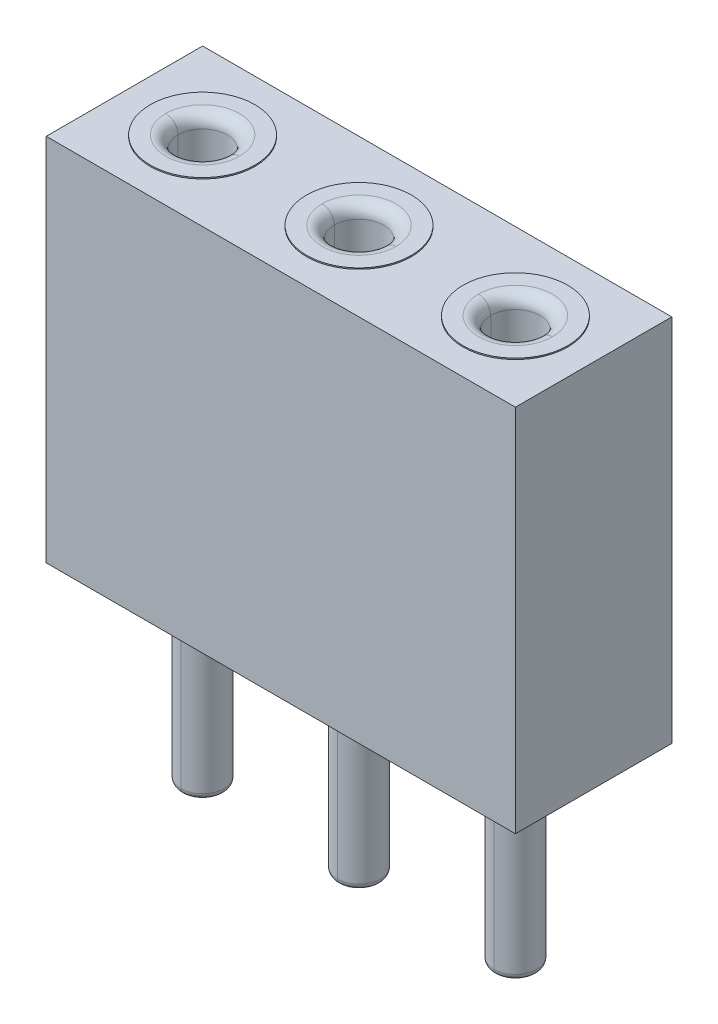
ISO-10303-21;
HEADER;
FILE_DESCRIPTION(('STEP AP214'),'2;1');
FILE_NAME('part.step','',(''),(''),'','','');
FILE_SCHEMA(('AUTOMOTIVE_DESIGN { 1 0 10303 214 1 1 1 1 }'));
ENDSEC;
DATA;
#1=APPLICATION_CONTEXT('core data for automotive mechanical design processes');
#2=APPLICATION_PROTOCOL_DEFINITION('international standard','automotive_design',2000,#1);
#3=PRODUCT_CONTEXT('',#1,'mechanical');
#4=PRODUCT('Part','Part','',(#3));
#5=PRODUCT_RELATED_PRODUCT_CATEGORY('part','',(#4));
#6=PRODUCT_DEFINITION_FORMATION('','',#4);
#7=PRODUCT_DEFINITION_CONTEXT('part definition',#1,'design');
#8=PRODUCT_DEFINITION('design','',#6,#7);
#9=PRODUCT_DEFINITION_SHAPE('','',#8);
#10=(LENGTH_UNIT() NAMED_UNIT(*) SI_UNIT(.MILLI.,.METRE.));
#11=(NAMED_UNIT(*) PLANE_ANGLE_UNIT() SI_UNIT($,.RADIAN.));
#12=(NAMED_UNIT(*) SI_UNIT($,.STERADIAN.) SOLID_ANGLE_UNIT());
#13=UNCERTAINTY_MEASURE_WITH_UNIT(LENGTH_MEASURE(1.E-05),#10,'distance_accuracy_value','');
#14=(GEOMETRIC_REPRESENTATION_CONTEXT(3) GLOBAL_UNCERTAINTY_ASSIGNED_CONTEXT((#13)) GLOBAL_UNIT_ASSIGNED_CONTEXT((#10,
#11,#12)) REPRESENTATION_CONTEXT('',''));
#15=CARTESIAN_POINT('',(0.,0.,0.));
#16=DIRECTION('',(0.,0.,1.));
#17=DIRECTION('',(1.,0.,0.));
#18=AXIS2_PLACEMENT_3D('',#15,#16,#17);
#19=CARTESIAN_POINT('',(6.35,5.82,1.27));
#20=DIRECTION('',(0.,1.,0.));
#21=DIRECTION('',(-1.,0.,0.));
#22=AXIS2_PLACEMENT_3D('',#19,#20,#21);
#23=TOROIDAL_SURFACE('',#22,0.6,0.2);
#24=CARTESIAN_POINT('',(6.95,5.82,1.27));
#25=DIRECTION('',(0.,0.,1.));
#26=DIRECTION('',(1.,0.,0.));
#27=AXIS2_PLACEMENT_3D('',#24,#25,#26);
#28=CIRCLE('',#27,0.2);
#29=CARTESIAN_POINT('',(6.95,6.02,1.27));
#30=VERTEX_POINT('',#29);
#31=CARTESIAN_POINT('',(6.75,5.82,1.27));
#32=VERTEX_POINT('',#31);
#33=EDGE_CURVE('E403',#30,#32,#28,.T.);
#34=ORIENTED_EDGE('',*,*,#33,.F.);
#35=CARTESIAN_POINT('',(6.35,6.02,1.27));
#36=DIRECTION('',(0.,-1.,0.));
#37=DIRECTION('',(-1.,0.,0.));
#38=AXIS2_PLACEMENT_3D('',#35,#36,#37);
#39=CIRCLE('',#38,0.6);
#40=CARTESIAN_POINT('',(5.75,6.02,1.27));
#41=VERTEX_POINT('',#40);
#42=EDGE_CURVE('E361',#41,#30,#39,.T.);
#43=ORIENTED_EDGE('',*,*,#42,.F.);
#44=CARTESIAN_POINT('',(5.75,5.82,1.27));
#45=DIRECTION('',(0.,0.,-1.));
#46=DIRECTION('',(-1.,0.,0.));
#47=AXIS2_PLACEMENT_3D('',#44,#45,#46);
#48=CIRCLE('',#47,0.2);
#49=CARTESIAN_POINT('',(5.95,5.82,1.27));
#50=VERTEX_POINT('',#49);
#51=EDGE_CURVE('E384',#41,#50,#48,.T.);
#52=ORIENTED_EDGE('',*,*,#51,.T.);
#53=CARTESIAN_POINT('',(6.35,5.82,1.27));
#54=DIRECTION('',(0.,1.,0.));
#55=DIRECTION('',(-1.,0.,0.));
#56=AXIS2_PLACEMENT_3D('',#53,#54,#55);
#57=CIRCLE('',#56,0.4);
#58=EDGE_CURVE('E393',#32,#50,#57,.T.);
#59=ORIENTED_EDGE('',*,*,#58,.F.);
#60=EDGE_LOOP('',(#34,#43,#52,#59));
#61=FACE_BOUND('',#60,.T.);
#62=ADVANCED_FACE('F16',(#61),#23,.T.);
#63=CARTESIAN_POINT('',(3.81,5.82,1.27));
#64=DIRECTION('',(0.,1.,0.));
#65=DIRECTION('',(-1.,0.,0.));
#66=AXIS2_PLACEMENT_3D('',#63,#64,#65);
#67=TOROIDAL_SURFACE('',#66,0.6,0.2);
#68=CARTESIAN_POINT('',(4.41,5.82,1.27));
#69=DIRECTION('',(0.,0.,1.));
#70=DIRECTION('',(1.,0.,0.));
#71=AXIS2_PLACEMENT_3D('',#68,#69,#70);
#72=CIRCLE('',#71,0.2);
#73=CARTESIAN_POINT('',(4.41,6.02,1.27));
#74=VERTEX_POINT('',#73);
#75=CARTESIAN_POINT('',(4.21,5.82,1.27));
#76=VERTEX_POINT('',#75);
#77=EDGE_CURVE('E246',#74,#76,#72,.T.);
#78=ORIENTED_EDGE('',*,*,#77,.F.);
#79=CARTESIAN_POINT('',(3.81,6.02,1.27));
#80=DIRECTION('',(0.,-1.,0.));
#81=DIRECTION('',(-1.,0.,0.));
#82=AXIS2_PLACEMENT_3D('',#79,#80,#81);
#83=CIRCLE('',#82,0.6);
#84=CARTESIAN_POINT('',(3.21,6.02,1.27));
#85=VERTEX_POINT('',#84);
#86=EDGE_CURVE('E353',#85,#74,#83,.T.);
#87=ORIENTED_EDGE('',*,*,#86,.F.);
#88=CARTESIAN_POINT('',(3.21,5.82,1.27));
#89=DIRECTION('',(0.,0.,-1.));
#90=DIRECTION('',(-1.,0.,0.));
#91=AXIS2_PLACEMENT_3D('',#88,#89,#90);
#92=CIRCLE('',#91,0.2);
#93=CARTESIAN_POINT('',(3.41,5.82,1.27));
#94=VERTEX_POINT('',#93);
#95=EDGE_CURVE('E555',#85,#94,#92,.T.);
#96=ORIENTED_EDGE('',*,*,#95,.T.);
#97=CARTESIAN_POINT('',(3.81,5.82,1.27));
#98=DIRECTION('',(0.,1.,0.));
#99=DIRECTION('',(-1.,0.,0.));
#100=AXIS2_PLACEMENT_3D('',#97,#98,#99);
#101=CIRCLE('',#100,0.4);
#102=EDGE_CURVE('E343',#76,#94,#101,.T.);
#103=ORIENTED_EDGE('',*,*,#102,.F.);
#104=EDGE_LOOP('',(#78,#87,#96,#103));
#105=FACE_BOUND('',#104,.T.);
#106=ADVANCED_FACE('F943',(#105),#67,.T.);
#107=CARTESIAN_POINT('',(1.27,5.82,1.27));
#108=DIRECTION('',(0.,1.,0.));
#109=DIRECTION('',(-1.,0.,0.));
#110=AXIS2_PLACEMENT_3D('',#107,#108,#109);
#111=TOROIDAL_SURFACE('',#110,0.6,0.2);
#112=CARTESIAN_POINT('',(1.87,5.82,1.27));
#113=DIRECTION('',(0.,0.,1.));
#114=DIRECTION('',(1.,0.,0.));
#115=AXIS2_PLACEMENT_3D('',#112,#113,#114);
#116=CIRCLE('',#115,0.2);
#117=CARTESIAN_POINT('',(1.87,6.02,1.27));
#118=VERTEX_POINT('',#117);
#119=CARTESIAN_POINT('',(1.67,5.82,1.27));
#120=VERTEX_POINT('',#119);
#121=EDGE_CURVE('E543',#118,#120,#116,.T.);
#122=ORIENTED_EDGE('',*,*,#121,.F.);
#123=CARTESIAN_POINT('',(1.27,6.02,1.27));
#124=DIRECTION('',(0.,-1.,0.));
#125=DIRECTION('',(-1.,0.,0.));
#126=AXIS2_PLACEMENT_3D('',#123,#124,#125);
#127=CIRCLE('',#126,0.6);
#128=CARTESIAN_POINT('',(0.67,6.02,1.27));
#129=VERTEX_POINT('',#128);
#130=EDGE_CURVE('E295',#129,#118,#127,.T.);
#131=ORIENTED_EDGE('',*,*,#130,.F.);
#132=CARTESIAN_POINT('',(0.67,5.82,1.27));
#133=DIRECTION('',(0.,0.,-1.));
#134=DIRECTION('',(-1.,0.,0.));
#135=AXIS2_PLACEMENT_3D('',#132,#133,#134);
#136=CIRCLE('',#135,0.2);
#137=CARTESIAN_POINT('',(0.87,5.82,1.27));
#138=VERTEX_POINT('',#137);
#139=EDGE_CURVE('E292',#129,#138,#136,.T.);
#140=ORIENTED_EDGE('',*,*,#139,.T.);
#141=CARTESIAN_POINT('',(1.27,5.82,1.27));
#142=DIRECTION('',(0.,1.,0.));
#143=DIRECTION('',(-1.,0.,0.));
#144=AXIS2_PLACEMENT_3D('',#141,#142,#143);
#145=CIRCLE('',#144,0.4);
#146=EDGE_CURVE('E149',#120,#138,#145,.T.);
#147=ORIENTED_EDGE('',*,*,#146,.F.);
#148=EDGE_LOOP('',(#122,#131,#140,#147));
#149=FACE_BOUND('',#148,.T.);
#150=ADVANCED_FACE('F572',(#149),#111,.T.);
#151=CARTESIAN_POINT('',(1.27,3.02,1.27));
#152=DIRECTION('',(0.,1.,0.));
#153=DIRECTION('',(1.,0.,0.));
#154=AXIS2_PLACEMENT_3D('',#151,#152,#153);
#155=PLANE('',#154);
#156=CARTESIAN_POINT('',(1.27,3.02,1.27));
#157=DIRECTION('',(0.,1.,0.));
#158=DIRECTION('',(-1.,0.,0.));
#159=AXIS2_PLACEMENT_3D('',#156,#157,#158);
#160=CIRCLE('',#159,0.4);
#161=CARTESIAN_POINT('',(0.87,3.02,1.27));
#162=VERTEX_POINT('',#161);
#163=CARTESIAN_POINT('',(1.67,3.02,1.27));
#164=VERTEX_POINT('',#163);
#165=EDGE_CURVE('E11',#162,#164,#160,.T.);
#166=ORIENTED_EDGE('',*,*,#165,.T.);
#167=CARTESIAN_POINT('',(1.27,3.02,1.27));
#168=DIRECTION('',(0.,1.,0.));
#169=DIRECTION('',(-1.,0.,0.));
#170=AXIS2_PLACEMENT_3D('',#167,#168,#169);
#171=CIRCLE('',#170,0.4);
#172=EDGE_CURVE('E277',#164,#162,#171,.T.);
#173=ORIENTED_EDGE('',*,*,#172,.T.);
#174=EDGE_LOOP('',(#166,#173));
#175=FACE_BOUND('',#174,.T.);
#176=ADVANCED_FACE('F580',(#175),#155,.T.);
#177=CARTESIAN_POINT('',(1.27,3.02,1.27));
#178=DIRECTION('',(0.,1.,0.));
#179=DIRECTION('',(-1.,0.,0.));
#180=AXIS2_PLACEMENT_3D('',#177,#178,#179);
#181=CYLINDRICAL_SURFACE('',#180,0.4);
#182=DIRECTION('',(0.,1.,0.));
#183=VECTOR('',#182,1.);
#184=CARTESIAN_POINT('',(1.67,3.02,1.27));
#185=LINE('',#184,#183);
#186=EDGE_CURVE('E274',#164,#120,#185,.T.);
#187=ORIENTED_EDGE('',*,*,#186,.F.);
#188=ORIENTED_EDGE('',*,*,#165,.F.);
#189=DIRECTION('',(0.,1.,0.));
#190=VECTOR('',#189,1.);
#191=CARTESIAN_POINT('',(0.87,3.02,1.27));
#192=LINE('',#191,#190);
#193=EDGE_CURVE('E137',#162,#138,#192,.T.);
#194=ORIENTED_EDGE('',*,*,#193,.T.);
#195=CARTESIAN_POINT('',(1.27,5.82,1.27));
#196=DIRECTION('',(0.,1.,0.));
#197=DIRECTION('',(-1.,0.,0.));
#198=AXIS2_PLACEMENT_3D('',#195,#196,#197);
#199=CIRCLE('',#198,0.4);
#200=EDGE_CURVE('E540',#138,#120,#199,.T.);
#201=ORIENTED_EDGE('',*,*,#200,.T.);
#202=EDGE_LOOP('',(#187,#188,#194,#201));
#203=FACE_BOUND('',#202,.T.);
#204=ADVANCED_FACE('F578',(#203),#181,.F.);
#205=CARTESIAN_POINT('',(6.35,3.02,1.27));
#206=DIRECTION('',(0.,1.,0.));
#207=DIRECTION('',(1.,0.,0.));
#208=AXIS2_PLACEMENT_3D('',#205,#206,#207);
#209=PLANE('',#208);
#210=CARTESIAN_POINT('',(6.35,3.02,1.27));
#211=DIRECTION('',(0.,1.,0.));
#212=DIRECTION('',(-1.,0.,0.));
#213=AXIS2_PLACEMENT_3D('',#210,#211,#212);
#214=CIRCLE('',#213,0.4);
#215=CARTESIAN_POINT('',(5.95,3.02,1.27));
#216=VERTEX_POINT('',#215);
#217=CARTESIAN_POINT('',(6.75,3.02,1.27));
#218=VERTEX_POINT('',#217);
#219=EDGE_CURVE('E27',#216,#218,#214,.T.);
#220=ORIENTED_EDGE('',*,*,#219,.T.);
#221=CARTESIAN_POINT('',(6.35,3.02,1.27));
#222=DIRECTION('',(0.,1.,0.));
#223=DIRECTION('',(-1.,0.,0.));
#224=AXIS2_PLACEMENT_3D('',#221,#222,#223);
#225=CIRCLE('',#224,0.4);
#226=EDGE_CURVE('E269',#218,#216,#225,.T.);
#227=ORIENTED_EDGE('',*,*,#226,.T.);
#228=EDGE_LOOP('',(#220,#227));
#229=FACE_BOUND('',#228,.T.);
#230=ADVANCED_FACE('F911',(#229),#209,.T.);
#231=CARTESIAN_POINT('',(6.35,3.02,1.27));
#232=DIRECTION('',(0.,1.,0.));
#233=DIRECTION('',(-1.,0.,0.));
#234=AXIS2_PLACEMENT_3D('',#231,#232,#233);
#235=CYLINDRICAL_SURFACE('',#234,0.4);
#236=DIRECTION('',(0.,1.,0.));
#237=VECTOR('',#236,1.);
#238=CARTESIAN_POINT('',(6.75,3.02,1.27));
#239=LINE('',#238,#237);
#240=EDGE_CURVE('E273',#218,#32,#239,.T.);
#241=ORIENTED_EDGE('',*,*,#240,.F.);
#242=ORIENTED_EDGE('',*,*,#219,.F.);
#243=DIRECTION('',(0.,1.,0.));
#244=VECTOR('',#243,1.);
#245=CARTESIAN_POINT('',(5.95,3.02,1.27));
#246=LINE('',#245,#244);
#247=EDGE_CURVE('E262',#216,#50,#246,.T.);
#248=ORIENTED_EDGE('',*,*,#247,.T.);
#249=CARTESIAN_POINT('',(6.35,5.82,1.27));
#250=DIRECTION('',(0.,1.,0.));
#251=DIRECTION('',(-1.,0.,0.));
#252=AXIS2_PLACEMENT_3D('',#249,#250,#251);
#253=CIRCLE('',#252,0.4);
#254=EDGE_CURVE('E389',#50,#32,#253,.T.);
#255=ORIENTED_EDGE('',*,*,#254,.T.);
#256=EDGE_LOOP('',(#241,#242,#248,#255));
#257=FACE_BOUND('',#256,.T.);
#258=ADVANCED_FACE('F916',(#257),#235,.F.);
#259=CARTESIAN_POINT('',(3.81,3.02,1.27));
#260=DIRECTION('',(0.,1.,0.));
#261=DIRECTION('',(1.,0.,0.));
#262=AXIS2_PLACEMENT_3D('',#259,#260,#261);
#263=PLANE('',#262);
#264=CARTESIAN_POINT('',(3.81,3.02,1.27));
#265=DIRECTION('',(0.,1.,0.));
#266=DIRECTION('',(-1.,0.,0.));
#267=AXIS2_PLACEMENT_3D('',#264,#265,#266);
#268=CIRCLE('',#267,0.4);
#269=CARTESIAN_POINT('',(3.41,3.02,1.27));
#270=VERTEX_POINT('',#269);
#271=CARTESIAN_POINT('',(4.21,3.02,1.27));
#272=VERTEX_POINT('',#271);
#273=EDGE_CURVE('E203',#270,#272,#268,.T.);
#274=ORIENTED_EDGE('',*,*,#273,.T.);
#275=CARTESIAN_POINT('',(3.81,3.02,1.27));
#276=DIRECTION('',(0.,1.,0.));
#277=DIRECTION('',(-1.,0.,0.));
#278=AXIS2_PLACEMENT_3D('',#275,#276,#277);
#279=CIRCLE('',#278,0.4);
#280=EDGE_CURVE('E257',#272,#270,#279,.T.);
#281=ORIENTED_EDGE('',*,*,#280,.T.);
#282=EDGE_LOOP('',(#274,#281));
#283=FACE_BOUND('',#282,.T.);
#284=ADVANCED_FACE('F903',(#283),#263,.T.);
#285=CARTESIAN_POINT('',(3.81,3.02,1.27));
#286=DIRECTION('',(0.,1.,0.));
#287=DIRECTION('',(-1.,0.,0.));
#288=AXIS2_PLACEMENT_3D('',#285,#286,#287);
#289=CYLINDRICAL_SURFACE('',#288,0.4);
#290=DIRECTION('',(0.,1.,0.));
#291=VECTOR('',#290,1.);
#292=CARTESIAN_POINT('',(4.21,3.02,1.27));
#293=LINE('',#292,#291);
#294=EDGE_CURVE('E261',#272,#76,#293,.T.);
#295=ORIENTED_EDGE('',*,*,#294,.F.);
#296=ORIENTED_EDGE('',*,*,#273,.F.);
#297=DIRECTION('',(0.,1.,0.));
#298=VECTOR('',#297,1.);
#299=CARTESIAN_POINT('',(3.41,3.02,1.27));
#300=LINE('',#299,#298);
#301=EDGE_CURVE('E347',#270,#94,#300,.T.);
#302=ORIENTED_EDGE('',*,*,#301,.T.);
#303=CARTESIAN_POINT('',(3.81,5.82,1.27));
#304=DIRECTION('',(0.,1.,0.));
#305=DIRECTION('',(-1.,0.,0.));
#306=AXIS2_PLACEMENT_3D('',#303,#304,#305);
#307=CIRCLE('',#306,0.4);
#308=EDGE_CURVE('E560',#94,#76,#307,.T.);
#309=ORIENTED_EDGE('',*,*,#308,.T.);
#310=EDGE_LOOP('',(#295,#296,#302,#309));
#311=FACE_BOUND('',#310,.T.);
#312=ADVANCED_FACE('F898',(#311),#289,.F.);
#313=CARTESIAN_POINT('',(1.27,6.02,1.27));
#314=DIRECTION('',(0.,1.,0.));
#315=DIRECTION('',(1.,0.,0.));
#316=AXIS2_PLACEMENT_3D('',#313,#314,#315);
#317=PLANE('',#316);
#318=CARTESIAN_POINT('',(1.27,6.02,1.27));
#319=DIRECTION('',(0.,1.,0.));
#320=DIRECTION('',(-1.,0.,0.));
#321=AXIS2_PLACEMENT_3D('',#318,#319,#320);
#322=CIRCLE('',#321,0.85);
#323=CARTESIAN_POINT('',(2.12,6.02,1.27));
#324=VERTEX_POINT('',#323);
#325=CARTESIAN_POINT('',(0.42,6.02,1.27));
#326=VERTEX_POINT('',#325);
#327=EDGE_CURVE('E188',#324,#326,#322,.T.);
#328=ORIENTED_EDGE('',*,*,#327,.T.);
#329=CARTESIAN_POINT('',(1.27,6.02,1.27));
#330=DIRECTION('',(0.,1.,0.));
#331=DIRECTION('',(-1.,0.,0.));
#332=AXIS2_PLACEMENT_3D('',#329,#330,#331);
#333=CIRCLE('',#332,0.85);
#334=EDGE_CURVE('E407',#326,#324,#333,.T.);
#335=ORIENTED_EDGE('',*,*,#334,.T.);
#336=EDGE_LOOP('',(#328,#335));
#337=FACE_BOUND('',#336,.T.);
#338=ORIENTED_EDGE('',*,*,#130,.T.);
#339=CARTESIAN_POINT('',(1.27,6.02,1.27));
#340=DIRECTION('',(0.,-1.,0.));
#341=DIRECTION('',(-1.,0.,0.));
#342=AXIS2_PLACEMENT_3D('',#339,#340,#341);
#343=CIRCLE('',#342,0.6);
#344=EDGE_CURVE('E559',#118,#129,#343,.T.);
#345=ORIENTED_EDGE('',*,*,#344,.T.);
#346=EDGE_LOOP('',(#338,#345));
#347=FACE_BOUND('',#346,.T.);
#348=ADVANCED_FACE('F613',(#337,#347),#317,.T.);
#349=CARTESIAN_POINT('',(1.27,6.02,1.27));
#350=DIRECTION('',(0.,-1.,0.));
#351=DIRECTION('',(1.,0.,0.));
#352=AXIS2_PLACEMENT_3D('',#349,#350,#351);
#353=CYLINDRICAL_SURFACE('',#352,0.85);
#354=DIRECTION('',(0.,-1.,0.));
#355=VECTOR('',#354,1.);
#356=CARTESIAN_POINT('',(0.42,6.02,1.27));
#357=LINE('',#356,#355);
#358=CARTESIAN_POINT('',(0.42,6.,1.27));
#359=VERTEX_POINT('',#358);
#360=EDGE_CURVE('E410',#326,#359,#357,.T.);
#361=ORIENTED_EDGE('',*,*,#360,.F.);
#362=ORIENTED_EDGE('',*,*,#327,.F.);
#363=DIRECTION('',(0.,-1.,0.));
#364=VECTOR('',#363,1.);
#365=CARTESIAN_POINT('',(2.12,6.02,1.27));
#366=LINE('',#365,#364);
#367=CARTESIAN_POINT('',(2.12,6.,1.27));
#368=VERTEX_POINT('',#367);
#369=EDGE_CURVE('E367',#324,#368,#366,.T.);
#370=ORIENTED_EDGE('',*,*,#369,.T.);
#371=CARTESIAN_POINT('',(1.27,6.,1.27));
#372=DIRECTION('',(0.,1.,0.));
#373=DIRECTION('',(1.,0.,0.));
#374=AXIS2_PLACEMENT_3D('',#371,#372,#373);
#375=CIRCLE('',#374,0.85);
#376=EDGE_CURVE('E485',#368,#359,#375,.T.);
#377=ORIENTED_EDGE('',*,*,#376,.T.);
#378=EDGE_LOOP('',(#361,#362,#370,#377));
#379=FACE_BOUND('',#378,.T.);
#380=ADVANCED_FACE('F869',(#379),#353,.T.);
#381=CARTESIAN_POINT('',(6.35,6.02,1.27));
#382=DIRECTION('',(0.,1.,0.));
#383=DIRECTION('',(1.,0.,0.));
#384=AXIS2_PLACEMENT_3D('',#381,#382,#383);
#385=PLANE('',#384);
#386=CARTESIAN_POINT('',(6.35,6.02,1.27));
#387=DIRECTION('',(0.,1.,0.));
#388=DIRECTION('',(-1.,0.,0.));
#389=AXIS2_PLACEMENT_3D('',#386,#387,#388);
#390=CIRCLE('',#389,0.85);
#391=CARTESIAN_POINT('',(7.2,6.02,1.27));
#392=VERTEX_POINT('',#391);
#393=CARTESIAN_POINT('',(5.5,6.02,1.27));
#394=VERTEX_POINT('',#393);
#395=EDGE_CURVE('E357',#392,#394,#390,.T.);
#396=ORIENTED_EDGE('',*,*,#395,.T.);
#397=CARTESIAN_POINT('',(6.35,6.02,1.27));
#398=DIRECTION('',(0.,1.,0.));
#399=DIRECTION('',(-1.,0.,0.));
#400=AXIS2_PLACEMENT_3D('',#397,#398,#399);
#401=CIRCLE('',#400,0.85);
#402=EDGE_CURVE('E301',#394,#392,#401,.T.);
#403=ORIENTED_EDGE('',*,*,#402,.T.);
#404=EDGE_LOOP('',(#396,#403));
#405=FACE_BOUND('',#404,.T.);
#406=ORIENTED_EDGE('',*,*,#42,.T.);
#407=CARTESIAN_POINT('',(6.35,6.02,1.27));
#408=DIRECTION('',(0.,-1.,0.));
#409=DIRECTION('',(-1.,0.,0.));
#410=AXIS2_PLACEMENT_3D('',#407,#408,#409);
#411=CIRCLE('',#410,0.6);
#412=EDGE_CURVE('E414',#30,#41,#411,.T.);
#413=ORIENTED_EDGE('',*,*,#412,.T.);
#414=EDGE_LOOP('',(#406,#413));
#415=FACE_BOUND('',#414,.T.);
#416=ADVANCED_FACE('F858',(#405,#415),#385,.T.);
#417=CARTESIAN_POINT('',(6.35,6.02,1.27));
#418=DIRECTION('',(0.,-1.,0.));
#419=DIRECTION('',(1.,0.,0.));
#420=AXIS2_PLACEMENT_3D('',#417,#418,#419);
#421=CYLINDRICAL_SURFACE('',#420,0.85);
#422=DIRECTION('',(0.,-1.,0.));
#423=VECTOR('',#422,1.);
#424=CARTESIAN_POINT('',(5.5,6.02,1.27));
#425=LINE('',#424,#423);
#426=CARTESIAN_POINT('',(5.5,6.,1.27));
#427=VERTEX_POINT('',#426);
#428=EDGE_CURVE('E296',#394,#427,#425,.T.);
#429=ORIENTED_EDGE('',*,*,#428,.F.);
#430=ORIENTED_EDGE('',*,*,#395,.F.);
#431=DIRECTION('',(0.,-1.,0.));
#432=VECTOR('',#431,1.);
#433=CARTESIAN_POINT('',(7.2,6.02,1.27));
#434=LINE('',#433,#432);
#435=CARTESIAN_POINT('',(7.2,6.,1.27));
#436=VERTEX_POINT('',#435);
#437=EDGE_CURVE('E312',#392,#436,#434,.T.);
#438=ORIENTED_EDGE('',*,*,#437,.T.);
#439=CARTESIAN_POINT('',(6.35,6.,1.27));
#440=DIRECTION('',(0.,1.,0.));
#441=DIRECTION('',(1.,0.,0.));
#442=AXIS2_PLACEMENT_3D('',#439,#440,#441);
#443=CIRCLE('',#442,0.85);
#444=EDGE_CURVE('E252',#436,#427,#443,.T.);
#445=ORIENTED_EDGE('',*,*,#444,.T.);
#446=EDGE_LOOP('',(#429,#430,#438,#445));
#447=FACE_BOUND('',#446,.T.);
#448=ADVANCED_FACE('F852',(#447),#421,.T.);
#449=CARTESIAN_POINT('',(3.81,6.02,1.27));
#450=DIRECTION('',(0.,1.,0.));
#451=DIRECTION('',(1.,0.,0.));
#452=AXIS2_PLACEMENT_3D('',#449,#450,#451);
#453=PLANE('',#452);
#454=CARTESIAN_POINT('',(3.81,6.02,1.27));
#455=DIRECTION('',(0.,1.,0.));
#456=DIRECTION('',(-1.,0.,0.));
#457=AXIS2_PLACEMENT_3D('',#454,#455,#456);
#458=CIRCLE('',#457,0.85);
#459=CARTESIAN_POINT('',(4.66,6.02,1.27));
#460=VERTEX_POINT('',#459);
#461=CARTESIAN_POINT('',(2.96,6.02,1.27));
#462=VERTEX_POINT('',#461);
#463=EDGE_CURVE('E358',#460,#462,#458,.T.);
#464=ORIENTED_EDGE('',*,*,#463,.T.);
#465=CARTESIAN_POINT('',(3.81,6.02,1.27));
#466=DIRECTION('',(0.,1.,0.));
#467=DIRECTION('',(-1.,0.,0.));
#468=AXIS2_PLACEMENT_3D('',#465,#466,#467);
#469=CIRCLE('',#468,0.85);
#470=EDGE_CURVE('E307',#462,#460,#469,.T.);
#471=ORIENTED_EDGE('',*,*,#470,.T.);
#472=EDGE_LOOP('',(#464,#471));
#473=FACE_BOUND('',#472,.T.);
#474=ORIENTED_EDGE('',*,*,#86,.T.);
#475=CARTESIAN_POINT('',(3.81,6.02,1.27));
#476=DIRECTION('',(0.,-1.,0.));
#477=DIRECTION('',(-1.,0.,0.));
#478=AXIS2_PLACEMENT_3D('',#475,#476,#477);
#479=CIRCLE('',#478,0.6);
#480=EDGE_CURVE('E388',#74,#85,#479,.T.);
#481=ORIENTED_EDGE('',*,*,#480,.T.);
#482=EDGE_LOOP('',(#474,#481));
#483=FACE_BOUND('',#482,.T.);
#484=ADVANCED_FACE('F857',(#473,#483),#453,.T.);
#485=CARTESIAN_POINT('',(3.81,6.02,1.27));
#486=DIRECTION('',(0.,-1.,0.));
#487=DIRECTION('',(1.,0.,0.));
#488=AXIS2_PLACEMENT_3D('',#485,#486,#487);
#489=CYLINDRICAL_SURFACE('',#488,0.85);
#490=DIRECTION('',(0.,-1.,0.));
#491=VECTOR('',#490,1.);
#492=CARTESIAN_POINT('',(2.96,6.02,1.27));
#493=LINE('',#492,#491);
#494=CARTESIAN_POINT('',(2.96,6.,1.27));
#495=VERTEX_POINT('',#494);
#496=EDGE_CURVE('E311',#462,#495,#493,.T.);
#497=ORIENTED_EDGE('',*,*,#496,.F.);
#498=ORIENTED_EDGE('',*,*,#463,.F.);
#499=DIRECTION('',(0.,-1.,0.));
#500=VECTOR('',#499,1.);
#501=CARTESIAN_POINT('',(4.66,6.02,1.27));
#502=LINE('',#501,#500);
#503=CARTESIAN_POINT('',(4.66,6.,1.27));
#504=VERTEX_POINT('',#503);
#505=EDGE_CURVE('E383',#460,#504,#502,.T.);
#506=ORIENTED_EDGE('',*,*,#505,.T.);
#507=CARTESIAN_POINT('',(3.81,6.,1.27));
#508=DIRECTION('',(0.,1.,0.));
#509=DIRECTION('',(1.,0.,0.));
#510=AXIS2_PLACEMENT_3D('',#507,#508,#509);
#511=CIRCLE('',#510,0.85);
#512=EDGE_CURVE('E682',#504,#495,#511,.T.);
#513=ORIENTED_EDGE('',*,*,#512,.T.);
#514=EDGE_LOOP('',(#497,#498,#506,#513));
#515=FACE_BOUND('',#514,.T.);
#516=ADVANCED_FACE('F18',(#515),#489,.T.);
#517=CARTESIAN_POINT('',(6.35,-3.,1.27));
#518=DIRECTION('',(0.,-1.,0.));
#519=DIRECTION('',(0.,0.,-1.));
#520=AXIS2_PLACEMENT_3D('',#517,#518,#519);
#521=TOROIDAL_SURFACE('',#520,0.25,0.1);
#522=CARTESIAN_POINT('',(6.35,-3.,1.52));
#523=DIRECTION('',(1.,0.,0.));
#524=DIRECTION('',(0.,0.,-1.));
#525=AXIS2_PLACEMENT_3D('',#522,#523,#524);
#526=CIRCLE('',#525,0.1);
#527=CARTESIAN_POINT('',(6.35,-3.,1.62));
#528=VERTEX_POINT('',#527);
#529=CARTESIAN_POINT('',(6.35,-3.1,1.52));
#530=VERTEX_POINT('',#529);
#531=EDGE_CURVE('E322',#528,#530,#526,.T.);
#532=ORIENTED_EDGE('',*,*,#531,.F.);
#533=CARTESIAN_POINT('',(6.35,-3.,1.27));
#534=DIRECTION('',(0.,1.,0.));
#535=DIRECTION('',(0.,0.,-1.));
#536=AXIS2_PLACEMENT_3D('',#533,#534,#535);
#537=CIRCLE('',#536,0.35);
#538=CARTESIAN_POINT('',(6.35,-3.,0.92));
#539=VERTEX_POINT('',#538);
#540=EDGE_CURVE('E220',#539,#528,#537,.T.);
#541=ORIENTED_EDGE('',*,*,#540,.F.);
#542=CARTESIAN_POINT('',(6.35,-3.,1.02));
#543=DIRECTION('',(-1.,0.,0.));
#544=DIRECTION('',(0.,0.,1.));
#545=AXIS2_PLACEMENT_3D('',#542,#543,#544);
#546=CIRCLE('',#545,0.1);
#547=CARTESIAN_POINT('',(6.35,-3.1,1.02));
#548=VERTEX_POINT('',#547);
#549=EDGE_CURVE('E321',#539,#548,#546,.T.);
#550=ORIENTED_EDGE('',*,*,#549,.T.);
#551=CARTESIAN_POINT('',(6.35,-3.1,1.27));
#552=DIRECTION('',(0.,-1.,0.));
#553=DIRECTION('',(0.,0.,-1.));
#554=AXIS2_PLACEMENT_3D('',#551,#552,#553);
#555=CIRCLE('',#554,0.25);
#556=EDGE_CURVE('E264',#530,#548,#555,.T.);
#557=ORIENTED_EDGE('',*,*,#556,.F.);
#558=EDGE_LOOP('',(#532,#541,#550,#557));
#559=FACE_BOUND('',#558,.T.);
#560=ADVANCED_FACE('F964',(#559),#521,.T.);
#561=CARTESIAN_POINT('',(3.81,-3.,1.27));
#562=DIRECTION('',(0.,-1.,0.));
#563=DIRECTION('',(0.,0.,-1.));
#564=AXIS2_PLACEMENT_3D('',#561,#562,#563);
#565=TOROIDAL_SURFACE('',#564,0.25,0.1);
#566=CARTESIAN_POINT('',(3.81,-3.,1.52));
#567=DIRECTION('',(1.,0.,0.));
#568=DIRECTION('',(0.,0.,-1.));
#569=AXIS2_PLACEMENT_3D('',#566,#567,#568);
#570=CIRCLE('',#569,0.1);
#571=CARTESIAN_POINT('',(3.81,-3.,1.62));
#572=VERTEX_POINT('',#571);
#573=CARTESIAN_POINT('',(3.81,-3.1,1.52));
#574=VERTEX_POINT('',#573);
#575=EDGE_CURVE('E235',#572,#574,#570,.T.);
#576=ORIENTED_EDGE('',*,*,#575,.F.);
#577=CARTESIAN_POINT('',(3.81,-3.,1.27));
#578=DIRECTION('',(0.,1.,0.));
#579=DIRECTION('',(0.,0.,-1.));
#580=AXIS2_PLACEMENT_3D('',#577,#578,#579);
#581=CIRCLE('',#580,0.35);
#582=CARTESIAN_POINT('',(3.81,-3.,0.92));
#583=VERTEX_POINT('',#582);
#584=EDGE_CURVE('E221',#583,#572,#581,.T.);
#585=ORIENTED_EDGE('',*,*,#584,.F.);
#586=CARTESIAN_POINT('',(3.81,-3.,1.02));
#587=DIRECTION('',(-1.,0.,0.));
#588=DIRECTION('',(0.,0.,1.));
#589=AXIS2_PLACEMENT_3D('',#586,#587,#588);
#590=CIRCLE('',#589,0.1);
#591=CARTESIAN_POINT('',(3.81,-3.1,1.02));
#592=VERTEX_POINT('',#591);
#593=EDGE_CURVE('E224',#583,#592,#590,.T.);
#594=ORIENTED_EDGE('',*,*,#593,.T.);
#595=CARTESIAN_POINT('',(3.81,-3.1,1.27));
#596=DIRECTION('',(0.,-1.,0.));
#597=DIRECTION('',(0.,0.,-1.));
#598=AXIS2_PLACEMENT_3D('',#595,#596,#597);
#599=CIRCLE('',#598,0.25);
#600=EDGE_CURVE('E211',#574,#592,#599,.T.);
#601=ORIENTED_EDGE('',*,*,#600,.F.);
#602=EDGE_LOOP('',(#576,#585,#594,#601));
#603=FACE_BOUND('',#602,.T.);
#604=ADVANCED_FACE('F225',(#603),#565,.T.);
#605=CARTESIAN_POINT('',(1.27,-3.,1.27));
#606=DIRECTION('',(0.,-1.,0.));
#607=DIRECTION('',(0.,0.,-1.));
#608=AXIS2_PLACEMENT_3D('',#605,#606,#607);
#609=TOROIDAL_SURFACE('',#608,0.25,0.1);
#610=CARTESIAN_POINT('',(1.27,-3.,1.52));
#611=DIRECTION('',(1.,0.,0.));
#612=DIRECTION('',(0.,0.,-1.));
#613=AXIS2_PLACEMENT_3D('',#610,#611,#612);
#614=CIRCLE('',#613,0.1);
#615=CARTESIAN_POINT('',(1.27,-3.,1.62));
#616=VERTEX_POINT('',#615);
#617=CARTESIAN_POINT('',(1.27,-3.1,1.52));
#618=VERTEX_POINT('',#617);
#619=EDGE_CURVE('E348',#616,#618,#614,.T.);
#620=ORIENTED_EDGE('',*,*,#619,.F.);
#621=CARTESIAN_POINT('',(1.27,-3.,1.27));
#622=DIRECTION('',(0.,1.,0.));
#623=DIRECTION('',(0.,0.,-1.));
#624=AXIS2_PLACEMENT_3D('',#621,#622,#623);
#625=CIRCLE('',#624,0.35);
#626=CARTESIAN_POINT('',(1.27,-3.,0.92));
#627=VERTEX_POINT('',#626);
#628=EDGE_CURVE('E318',#627,#616,#625,.T.);
#629=ORIENTED_EDGE('',*,*,#628,.F.);
#630=CARTESIAN_POINT('',(1.27,-3.,1.02));
#631=DIRECTION('',(-1.,0.,0.));
#632=DIRECTION('',(0.,0.,1.));
#633=AXIS2_PLACEMENT_3D('',#630,#631,#632);
#634=CIRCLE('',#633,0.1);
#635=CARTESIAN_POINT('',(1.27,-3.1,1.02));
#636=VERTEX_POINT('',#635);
#637=EDGE_CURVE('E333',#627,#636,#634,.T.);
#638=ORIENTED_EDGE('',*,*,#637,.T.);
#639=CARTESIAN_POINT('',(1.27,-3.1,1.27));
#640=DIRECTION('',(0.,-1.,0.));
#641=DIRECTION('',(0.,0.,-1.));
#642=AXIS2_PLACEMENT_3D('',#639,#640,#641);
#643=CIRCLE('',#642,0.25);
#644=EDGE_CURVE('E534',#618,#636,#643,.T.);
#645=ORIENTED_EDGE('',*,*,#644,.F.);
#646=EDGE_LOOP('',(#620,#629,#638,#645));
#647=FACE_BOUND('',#646,.T.);
#648=ADVANCED_FACE('F648',(#647),#609,.T.);
#649=CARTESIAN_POINT('',(1.27,-3.1,1.27));
#650=DIRECTION('',(0.,-1.,0.));
#651=DIRECTION('',(0.,0.,-1.));
#652=AXIS2_PLACEMENT_3D('',#649,#650,#651);
#653=PLANE('',#652);
#654=CARTESIAN_POINT('',(1.27,-3.1,1.27));
#655=DIRECTION('',(0.,-1.,0.));
#656=DIRECTION('',(0.,0.,-1.));
#657=AXIS2_PLACEMENT_3D('',#654,#655,#656);
#658=CIRCLE('',#657,0.25);
#659=EDGE_CURVE('E352',#636,#618,#658,.T.);
#660=ORIENTED_EDGE('',*,*,#659,.T.);
#661=ORIENTED_EDGE('',*,*,#644,.T.);
#662=EDGE_LOOP('',(#660,#661));
#663=FACE_BOUND('',#662,.T.);
#664=ADVANCED_FACE('F831',(#663),#653,.T.);
#665=CARTESIAN_POINT('',(1.27,-3.1,1.27));
#666=DIRECTION('',(0.,1.,0.));
#667=DIRECTION('',(0.,0.,1.));
#668=AXIS2_PLACEMENT_3D('',#665,#666,#667);
#669=CYLINDRICAL_SURFACE('',#668,0.35);
#670=DIRECTION('',(0.,1.,0.));
#671=VECTOR('',#670,1.);
#672=CARTESIAN_POINT('',(1.27,-3.1,0.92));
#673=LINE('',#672,#671);
#674=CARTESIAN_POINT('',(1.27,0.,0.92));
#675=VERTEX_POINT('',#674);
#676=EDGE_CURVE('E328',#627,#675,#673,.T.);
#677=ORIENTED_EDGE('',*,*,#676,.F.);
#678=ORIENTED_EDGE('',*,*,#628,.T.);
#679=DIRECTION('',(0.,1.,0.));
#680=VECTOR('',#679,1.);
#681=CARTESIAN_POINT('',(1.27,-3.1,1.62));
#682=LINE('',#681,#680);
#683=CARTESIAN_POINT('',(1.27,0.,1.62));
#684=VERTEX_POINT('',#683);
#685=EDGE_CURVE('E375',#616,#684,#682,.T.);
#686=ORIENTED_EDGE('',*,*,#685,.T.);
#687=CARTESIAN_POINT('',(1.27,0.,1.27));
#688=DIRECTION('',(0.,-1.,0.));
#689=DIRECTION('',(0.,0.,1.));
#690=AXIS2_PLACEMENT_3D('',#687,#688,#689);
#691=CIRCLE('',#690,0.35);
#692=EDGE_CURVE('E283',#684,#675,#691,.T.);
#693=ORIENTED_EDGE('',*,*,#692,.T.);
#694=EDGE_LOOP('',(#677,#678,#686,#693));
#695=FACE_BOUND('',#694,.T.);
#696=ADVANCED_FACE('F639',(#695),#669,.T.);
#697=CARTESIAN_POINT('',(6.35,-3.1,1.27));
#698=DIRECTION('',(0.,-1.,0.));
#699=DIRECTION('',(0.,0.,-1.));
#700=AXIS2_PLACEMENT_3D('',#697,#698,#699);
#701=PLANE('',#700);
#702=CARTESIAN_POINT('',(6.35,-3.1,1.27));
#703=DIRECTION('',(0.,-1.,0.));
#704=DIRECTION('',(0.,0.,-1.));
#705=AXIS2_PLACEMENT_3D('',#702,#703,#704);
#706=CIRCLE('',#705,0.25);
#707=EDGE_CURVE('E326',#548,#530,#706,.T.);
#708=ORIENTED_EDGE('',*,*,#707,.T.);
#709=ORIENTED_EDGE('',*,*,#556,.T.);
#710=EDGE_LOOP('',(#708,#709));
#711=FACE_BOUND('',#710,.T.);
#712=ADVANCED_FACE('F887',(#711),#701,.T.);
#713=CARTESIAN_POINT('',(6.35,-3.1,1.27));
#714=DIRECTION('',(0.,1.,0.));
#715=DIRECTION('',(0.,0.,1.));
#716=AXIS2_PLACEMENT_3D('',#713,#714,#715);
#717=CYLINDRICAL_SURFACE('',#716,0.35);
#718=DIRECTION('',(0.,1.,0.));
#719=VECTOR('',#718,1.);
#720=CARTESIAN_POINT('',(6.35,-3.1,0.92));
#721=LINE('',#720,#719);
#722=CARTESIAN_POINT('',(6.35,0.,0.92));
#723=VERTEX_POINT('',#722);
#724=EDGE_CURVE('E371',#539,#723,#721,.T.);
#725=ORIENTED_EDGE('',*,*,#724,.F.);
#726=ORIENTED_EDGE('',*,*,#540,.T.);
#727=DIRECTION('',(0.,1.,0.));
#728=VECTOR('',#727,1.);
#729=CARTESIAN_POINT('',(6.35,-3.1,1.62));
#730=LINE('',#729,#728);
#731=CARTESIAN_POINT('',(6.35,0.,1.62));
#732=VERTEX_POINT('',#731);
#733=EDGE_CURVE('E334',#528,#732,#730,.T.);
#734=ORIENTED_EDGE('',*,*,#733,.T.);
#735=CARTESIAN_POINT('',(6.35,0.,1.27));
#736=DIRECTION('',(0.,-1.,0.));
#737=DIRECTION('',(0.,0.,1.));
#738=AXIS2_PLACEMENT_3D('',#735,#736,#737);
#739=CIRCLE('',#738,0.35);
#740=EDGE_CURVE('E421',#732,#723,#739,.T.);
#741=ORIENTED_EDGE('',*,*,#740,.T.);
#742=EDGE_LOOP('',(#725,#726,#734,#741));
#743=FACE_BOUND('',#742,.T.);
#744=ADVANCED_FACE('F824',(#743),#717,.T.);
#745=CARTESIAN_POINT('',(3.81,-3.1,1.27));
#746=DIRECTION('',(0.,-1.,0.));
#747=DIRECTION('',(0.,0.,-1.));
#748=AXIS2_PLACEMENT_3D('',#745,#746,#747);
#749=PLANE('',#748);
#750=CARTESIAN_POINT('',(3.81,-3.1,1.27));
#751=DIRECTION('',(0.,-1.,0.));
#752=DIRECTION('',(0.,0.,-1.));
#753=AXIS2_PLACEMENT_3D('',#750,#751,#752);
#754=CIRCLE('',#753,0.25);
#755=EDGE_CURVE('E215',#592,#574,#754,.T.);
#756=ORIENTED_EDGE('',*,*,#755,.T.);
#757=ORIENTED_EDGE('',*,*,#600,.T.);
#758=EDGE_LOOP('',(#756,#757));
#759=FACE_BOUND('',#758,.T.);
#760=ADVANCED_FACE('F213',(#759),#749,.T.);
#761=CARTESIAN_POINT('',(3.81,-3.1,1.27));
#762=DIRECTION('',(0.,1.,0.));
#763=DIRECTION('',(0.,0.,1.));
#764=AXIS2_PLACEMENT_3D('',#761,#762,#763);
#765=CYLINDRICAL_SURFACE('',#764,0.35);
#766=DIRECTION('',(0.,1.,0.));
#767=VECTOR('',#766,1.);
#768=CARTESIAN_POINT('',(3.81,-3.1,0.92));
#769=LINE('',#768,#767);
#770=CARTESIAN_POINT('',(3.81,0.,0.92));
#771=VERTEX_POINT('',#770);
#772=EDGE_CURVE('E338',#583,#771,#769,.T.);
#773=ORIENTED_EDGE('',*,*,#772,.F.);
#774=ORIENTED_EDGE('',*,*,#584,.T.);
#775=DIRECTION('',(0.,1.,0.));
#776=VECTOR('',#775,1.);
#777=CARTESIAN_POINT('',(3.81,-3.1,1.62));
#778=LINE('',#777,#776);
#779=CARTESIAN_POINT('',(3.81,0.,1.62));
#780=VERTEX_POINT('',#779);
#781=EDGE_CURVE('E248',#572,#780,#778,.T.);
#782=ORIENTED_EDGE('',*,*,#781,.T.);
#783=CARTESIAN_POINT('',(3.81,0.,1.27));
#784=DIRECTION('',(0.,-1.,0.));
#785=DIRECTION('',(0.,0.,1.));
#786=AXIS2_PLACEMENT_3D('',#783,#784,#785);
#787=CIRCLE('',#786,0.35);
#788=EDGE_CURVE('E288',#780,#771,#787,.T.);
#789=ORIENTED_EDGE('',*,*,#788,.T.);
#790=EDGE_LOOP('',(#773,#774,#782,#789));
#791=FACE_BOUND('',#790,.T.);
#792=ADVANCED_FACE('F465',(#791),#765,.T.);
#793=CARTESIAN_POINT('',(0.,6.,0.));
#794=DIRECTION('',(0.,0.,-1.));
#795=DIRECTION('',(0.,-1.,0.));
#796=AXIS2_PLACEMENT_3D('',#793,#794,#795);
#797=PLANE('',#796);
#798=DIRECTION('',(0.,-1.,0.));
#799=VECTOR('',#798,1.);
#800=CARTESIAN_POINT('',(0.,0.,0.));
#801=LINE('',#800,#799);
#802=CARTESIAN_POINT('',(0.,6.,0.));
#803=VERTEX_POINT('',#802);
#804=CARTESIAN_POINT('',(0.,0.,0.));
#805=VERTEX_POINT('',#804);
#806=EDGE_CURVE('E287',#803,#805,#801,.T.);
#807=ORIENTED_EDGE('',*,*,#806,.F.);
#808=DIRECTION('',(-1.,0.,0.));
#809=VECTOR('',#808,1.);
#810=CARTESIAN_POINT('',(0.,6.,0.));
#811=LINE('',#810,#809);
#812=CARTESIAN_POINT('',(7.62,6.,0.));
#813=VERTEX_POINT('',#812);
#814=EDGE_CURVE('E302',#813,#803,#811,.T.);
#815=ORIENTED_EDGE('',*,*,#814,.F.);
#816=DIRECTION('',(0.,1.,0.));
#817=VECTOR('',#816,1.);
#818=CARTESIAN_POINT('',(7.62,0.,0.));
#819=LINE('',#818,#817);
#820=CARTESIAN_POINT('',(7.62,0.,0.));
#821=VERTEX_POINT('',#820);
#822=EDGE_CURVE('E376',#821,#813,#819,.T.);
#823=ORIENTED_EDGE('',*,*,#822,.F.);
#824=DIRECTION('',(1.,0.,0.));
#825=VECTOR('',#824,1.);
#826=CARTESIAN_POINT('',(0.,0.,0.));
#827=LINE('',#826,#825);
#828=EDGE_CURVE('E417',#805,#821,#827,.T.);
#829=ORIENTED_EDGE('',*,*,#828,.F.);
#830=EDGE_LOOP('',(#807,#815,#823,#829));
#831=FACE_BOUND('',#830,.T.);
#832=ADVANCED_FACE('F444',(#831),#797,.T.);
#833=CARTESIAN_POINT('',(0.,6.,2.54));
#834=DIRECTION('',(0.,0.,-1.));
#835=DIRECTION('',(0.,-1.,0.));
#836=AXIS2_PLACEMENT_3D('',#833,#834,#835);
#837=PLANE('',#836);
#838=DIRECTION('',(0.,-1.,0.));
#839=VECTOR('',#838,1.);
#840=CARTESIAN_POINT('',(0.,0.,2.54));
#841=LINE('',#840,#839);
#842=CARTESIAN_POINT('',(0.,6.,2.54));
#843=VERTEX_POINT('',#842);
#844=CARTESIAN_POINT('',(0.,0.,2.54));
#845=VERTEX_POINT('',#844);
#846=EDGE_CURVE('E41',#843,#845,#841,.T.);
#847=ORIENTED_EDGE('',*,*,#846,.T.);
#848=DIRECTION('',(1.,0.,0.));
#849=VECTOR('',#848,1.);
#850=CARTESIAN_POINT('',(0.,0.,2.54));
#851=LINE('',#850,#849);
#852=CARTESIAN_POINT('',(7.62,0.,2.54));
#853=VERTEX_POINT('',#852);
#854=EDGE_CURVE('E278',#845,#853,#851,.T.);
#855=ORIENTED_EDGE('',*,*,#854,.T.);
#856=DIRECTION('',(0.,1.,0.));
#857=VECTOR('',#856,1.);
#858=CARTESIAN_POINT('',(7.62,0.,2.54));
#859=LINE('',#858,#857);
#860=CARTESIAN_POINT('',(7.62,6.,2.54));
#861=VERTEX_POINT('',#860);
#862=EDGE_CURVE('E256',#853,#861,#859,.T.);
#863=ORIENTED_EDGE('',*,*,#862,.T.);
#864=DIRECTION('',(-1.,0.,0.));
#865=VECTOR('',#864,1.);
#866=CARTESIAN_POINT('',(0.,6.,2.54));
#867=LINE('',#866,#865);
#868=EDGE_CURVE('E340',#861,#843,#867,.T.);
#869=ORIENTED_EDGE('',*,*,#868,.T.);
#870=EDGE_LOOP('',(#847,#855,#863,#869));
#871=FACE_BOUND('',#870,.T.);
#872=ADVANCED_FACE('F752',(#871),#837,.F.);
#873=CARTESIAN_POINT('',(7.62,0.,2.54));
#874=DIRECTION('',(-1.,0.,0.));
#875=DIRECTION('',(0.,0.,1.));
#876=AXIS2_PLACEMENT_3D('',#873,#874,#875);
#877=PLANE('',#876);
#878=ORIENTED_EDGE('',*,*,#822,.T.);
#879=DIRECTION('',(0.,0.,-1.));
#880=VECTOR('',#879,1.);
#881=CARTESIAN_POINT('',(7.62,6.,2.54));
#882=LINE('',#881,#880);
#883=EDGE_CURVE('E20',#861,#813,#882,.T.);
#884=ORIENTED_EDGE('',*,*,#883,.F.);
#885=ORIENTED_EDGE('',*,*,#862,.F.);
#886=DIRECTION('',(0.,0.,-1.));
#887=VECTOR('',#886,1.);
#888=CARTESIAN_POINT('',(7.62,0.,2.54));
#889=LINE('',#888,#887);
#890=EDGE_CURVE('E282',#853,#821,#889,.T.);
#891=ORIENTED_EDGE('',*,*,#890,.T.);
#892=EDGE_LOOP('',(#878,#884,#885,#891));
#893=FACE_BOUND('',#892,.T.);
#894=ADVANCED_FACE('F433',(#893),#877,.F.);
#895=CARTESIAN_POINT('',(0.,0.,2.54));
#896=DIRECTION('',(1.,0.,0.));
#897=DIRECTION('',(0.,1.,0.));
#898=AXIS2_PLACEMENT_3D('',#895,#896,#897);
#899=PLANE('',#898);
#900=ORIENTED_EDGE('',*,*,#806,.T.);
#901=DIRECTION('',(0.,0.,-1.));
#902=VECTOR('',#901,1.);
#903=CARTESIAN_POINT('',(0.,0.,2.54));
#904=LINE('',#903,#902);
#905=EDGE_CURVE('E281',#845,#805,#904,.T.);
#906=ORIENTED_EDGE('',*,*,#905,.F.);
#907=ORIENTED_EDGE('',*,*,#846,.F.);
#908=DIRECTION('',(0.,0.,-1.));
#909=VECTOR('',#908,1.);
#910=CARTESIAN_POINT('',(0.,6.,2.54));
#911=LINE('',#910,#909);
#912=EDGE_CURVE('E306',#843,#803,#911,.T.);
#913=ORIENTED_EDGE('',*,*,#912,.T.);
#914=EDGE_LOOP('',(#900,#906,#907,#913));
#915=FACE_BOUND('',#914,.T.);
#916=ADVANCED_FACE('F735',(#915),#899,.F.);
#917=CARTESIAN_POINT('',(0.,0.,2.54));
#918=DIRECTION('',(0.,1.,0.));
#919=DIRECTION('',(1.,0.,0.));
#920=AXIS2_PLACEMENT_3D('',#917,#918,#919);
#921=PLANE('',#920);
#922=ORIENTED_EDGE('',*,*,#692,.F.);
#923=CARTESIAN_POINT('',(1.27,0.,1.27));
#924=DIRECTION('',(0.,-1.,0.));
#925=DIRECTION('',(0.,0.,1.));
#926=AXIS2_PLACEMENT_3D('',#923,#924,#925);
#927=CIRCLE('',#926,0.35);
#928=EDGE_CURVE('E332',#675,#684,#927,.T.);
#929=ORIENTED_EDGE('',*,*,#928,.F.);
#930=EDGE_LOOP('',(#922,#929));
#931=FACE_BOUND('',#930,.T.);
#932=ORIENTED_EDGE('',*,*,#788,.F.);
#933=CARTESIAN_POINT('',(3.81,0.,1.27));
#934=DIRECTION('',(0.,-1.,0.));
#935=DIRECTION('',(0.,0.,1.));
#936=AXIS2_PLACEMENT_3D('',#933,#934,#935);
#937=CIRCLE('',#936,0.35);
#938=EDGE_CURVE('E253',#771,#780,#937,.T.);
#939=ORIENTED_EDGE('',*,*,#938,.F.);
#940=EDGE_LOOP('',(#932,#939));
#941=FACE_BOUND('',#940,.T.);
#942=ORIENTED_EDGE('',*,*,#828,.T.);
#943=ORIENTED_EDGE('',*,*,#890,.F.);
#944=ORIENTED_EDGE('',*,*,#854,.F.);
#945=ORIENTED_EDGE('',*,*,#905,.T.);
#946=EDGE_LOOP('',(#942,#943,#944,#945));
#947=FACE_BOUND('',#946,.T.);
#948=ORIENTED_EDGE('',*,*,#740,.F.);
#949=CARTESIAN_POINT('',(6.35,0.,1.27));
#950=DIRECTION('',(0.,-1.,0.));
#951=DIRECTION('',(0.,0.,1.));
#952=AXIS2_PLACEMENT_3D('',#949,#950,#951);
#953=CIRCLE('',#952,0.35);
#954=EDGE_CURVE('E339',#723,#732,#953,.T.);
#955=ORIENTED_EDGE('',*,*,#954,.F.);
#956=EDGE_LOOP('',(#948,#955));
#957=FACE_BOUND('',#956,.T.);
#958=ADVANCED_FACE('F440',(#931,#941,#947,#957),#921,.F.);
#959=CARTESIAN_POINT('',(0.,6.,2.54));
#960=DIRECTION('',(0.,-1.,0.));
#961=DIRECTION('',(0.,0.,-1.));
#962=AXIS2_PLACEMENT_3D('',#959,#960,#961);
#963=PLANE('',#962);
#964=ORIENTED_EDGE('',*,*,#376,.F.);
#965=CARTESIAN_POINT('',(1.27,6.,1.27));
#966=DIRECTION('',(0.,1.,0.));
#967=DIRECTION('',(1.,0.,0.));
#968=AXIS2_PLACEMENT_3D('',#965,#966,#967);
#969=CIRCLE('',#968,0.85);
#970=EDGE_CURVE('E505',#359,#368,#969,.T.);
#971=ORIENTED_EDGE('',*,*,#970,.F.);
#972=EDGE_LOOP('',(#964,#971));
#973=FACE_BOUND('',#972,.T.);
#974=ORIENTED_EDGE('',*,*,#512,.F.);
#975=CARTESIAN_POINT('',(3.81,6.,1.27));
#976=DIRECTION('',(0.,1.,0.));
#977=DIRECTION('',(1.,0.,0.));
#978=AXIS2_PLACEMENT_3D('',#975,#976,#977);
#979=CIRCLE('',#978,0.85);
#980=EDGE_CURVE('E379',#495,#504,#979,.T.);
#981=ORIENTED_EDGE('',*,*,#980,.F.);
#982=EDGE_LOOP('',(#974,#981));
#983=FACE_BOUND('',#982,.T.);
#984=ORIENTED_EDGE('',*,*,#814,.T.);
#985=ORIENTED_EDGE('',*,*,#912,.F.);
#986=ORIENTED_EDGE('',*,*,#868,.F.);
#987=ORIENTED_EDGE('',*,*,#883,.T.);
#988=EDGE_LOOP('',(#984,#985,#986,#987));
#989=FACE_BOUND('',#988,.T.);
#990=ORIENTED_EDGE('',*,*,#444,.F.);
#991=CARTESIAN_POINT('',(6.35,6.,1.27));
#992=DIRECTION('',(0.,1.,0.));
#993=DIRECTION('',(1.,0.,0.));
#994=AXIS2_PLACEMENT_3D('',#991,#992,#993);
#995=CIRCLE('',#994,0.85);
#996=EDGE_CURVE('E300',#427,#436,#995,.T.);
#997=ORIENTED_EDGE('',*,*,#996,.F.);
#998=EDGE_LOOP('',(#990,#997));
#999=FACE_BOUND('',#998,.T.);
#1000=ADVANCED_FACE('F776',(#973,#983,#989,#999),#963,.F.);
#1001=CARTESIAN_POINT('',(3.81,-3.1,1.27));
#1002=DIRECTION('',(0.,1.,0.));
#1003=DIRECTION('',(0.,0.,1.));
#1004=AXIS2_PLACEMENT_3D('',#1001,#1002,#1003);
#1005=CYLINDRICAL_SURFACE('',#1004,0.35);
#1006=CARTESIAN_POINT('',(3.81,-3.,1.27));
#1007=DIRECTION('',(0.,1.,0.));
#1008=DIRECTION('',(0.,0.,-1.));
#1009=AXIS2_PLACEMENT_3D('',#1006,#1007,#1008);
#1010=CIRCLE('',#1009,0.35);
#1011=EDGE_CURVE('E242',#572,#583,#1010,.T.);
#1012=ORIENTED_EDGE('',*,*,#1011,.T.);
#1013=ORIENTED_EDGE('',*,*,#772,.T.);
#1014=ORIENTED_EDGE('',*,*,#938,.T.);
#1015=ORIENTED_EDGE('',*,*,#781,.F.);
#1016=EDGE_LOOP('',(#1012,#1013,#1014,#1015));
#1017=FACE_BOUND('',#1016,.T.);
#1018=ADVANCED_FACE('F472',(#1017),#1005,.T.);
#1019=CARTESIAN_POINT('',(6.35,-3.1,1.27));
#1020=DIRECTION('',(0.,1.,0.));
#1021=DIRECTION('',(0.,0.,1.));
#1022=AXIS2_PLACEMENT_3D('',#1019,#1020,#1021);
#1023=CYLINDRICAL_SURFACE('',#1022,0.35);
#1024=CARTESIAN_POINT('',(6.35,-3.,1.27));
#1025=DIRECTION('',(0.,1.,0.));
#1026=DIRECTION('',(0.,0.,-1.));
#1027=AXIS2_PLACEMENT_3D('',#1024,#1025,#1026);
#1028=CIRCLE('',#1027,0.35);
#1029=EDGE_CURVE('E327',#528,#539,#1028,.T.);
#1030=ORIENTED_EDGE('',*,*,#1029,.T.);
#1031=ORIENTED_EDGE('',*,*,#724,.T.);
#1032=ORIENTED_EDGE('',*,*,#954,.T.);
#1033=ORIENTED_EDGE('',*,*,#733,.F.);
#1034=EDGE_LOOP('',(#1030,#1031,#1032,#1033));
#1035=FACE_BOUND('',#1034,.T.);
#1036=ADVANCED_FACE('F775',(#1035),#1023,.T.);
#1037=CARTESIAN_POINT('',(1.27,-3.1,1.27));
#1038=DIRECTION('',(0.,1.,0.));
#1039=DIRECTION('',(0.,0.,1.));
#1040=AXIS2_PLACEMENT_3D('',#1037,#1038,#1039);
#1041=CYLINDRICAL_SURFACE('',#1040,0.35);
#1042=CARTESIAN_POINT('',(1.27,-3.,1.27));
#1043=DIRECTION('',(0.,1.,0.));
#1044=DIRECTION('',(0.,0.,-1.));
#1045=AXIS2_PLACEMENT_3D('',#1042,#1043,#1044);
#1046=CIRCLE('',#1045,0.35);
#1047=EDGE_CURVE('E232',#616,#627,#1046,.T.);
#1048=ORIENTED_EDGE('',*,*,#1047,.T.);
#1049=ORIENTED_EDGE('',*,*,#676,.T.);
#1050=ORIENTED_EDGE('',*,*,#928,.T.);
#1051=ORIENTED_EDGE('',*,*,#685,.F.);
#1052=EDGE_LOOP('',(#1048,#1049,#1050,#1051));
#1053=FACE_BOUND('',#1052,.T.);
#1054=ADVANCED_FACE('F645',(#1053),#1041,.T.);
#1055=CARTESIAN_POINT('',(1.27,-3.,1.27));
#1056=DIRECTION('',(0.,-1.,0.));
#1057=DIRECTION('',(0.,0.,-1.));
#1058=AXIS2_PLACEMENT_3D('',#1055,#1056,#1057);
#1059=TOROIDAL_SURFACE('',#1058,0.25,0.1);
#1060=ORIENTED_EDGE('',*,*,#1047,.F.);
#1061=ORIENTED_EDGE('',*,*,#619,.T.);
#1062=ORIENTED_EDGE('',*,*,#659,.F.);
#1063=ORIENTED_EDGE('',*,*,#637,.F.);
#1064=EDGE_LOOP('',(#1060,#1061,#1062,#1063));
#1065=FACE_BOUND('',#1064,.T.);
#1066=ADVANCED_FACE('F651',(#1065),#1059,.T.);
#1067=CARTESIAN_POINT('',(3.81,-3.,1.27));
#1068=DIRECTION('',(0.,-1.,0.));
#1069=DIRECTION('',(0.,0.,-1.));
#1070=AXIS2_PLACEMENT_3D('',#1067,#1068,#1069);
#1071=TOROIDAL_SURFACE('',#1070,0.25,0.1);
#1072=ORIENTED_EDGE('',*,*,#1011,.F.);
#1073=ORIENTED_EDGE('',*,*,#575,.T.);
#1074=ORIENTED_EDGE('',*,*,#755,.F.);
#1075=ORIENTED_EDGE('',*,*,#593,.F.);
#1076=EDGE_LOOP('',(#1072,#1073,#1074,#1075));
#1077=FACE_BOUND('',#1076,.T.);
#1078=ADVANCED_FACE('F234',(#1077),#1071,.T.);
#1079=CARTESIAN_POINT('',(6.35,-3.,1.27));
#1080=DIRECTION('',(0.,-1.,0.));
#1081=DIRECTION('',(0.,0.,-1.));
#1082=AXIS2_PLACEMENT_3D('',#1079,#1080,#1081);
#1083=TOROIDAL_SURFACE('',#1082,0.25,0.1);
#1084=ORIENTED_EDGE('',*,*,#1029,.F.);
#1085=ORIENTED_EDGE('',*,*,#531,.T.);
#1086=ORIENTED_EDGE('',*,*,#707,.F.);
#1087=ORIENTED_EDGE('',*,*,#549,.F.);
#1088=EDGE_LOOP('',(#1084,#1085,#1086,#1087));
#1089=FACE_BOUND('',#1088,.T.);
#1090=ADVANCED_FACE('F685',(#1089),#1083,.T.);
#1091=CARTESIAN_POINT('',(3.81,6.02,1.27));
#1092=DIRECTION('',(0.,-1.,0.));
#1093=DIRECTION('',(1.,0.,0.));
#1094=AXIS2_PLACEMENT_3D('',#1091,#1092,#1093);
#1095=CYLINDRICAL_SURFACE('',#1094,0.85);
#1096=ORIENTED_EDGE('',*,*,#470,.F.);
#1097=ORIENTED_EDGE('',*,*,#496,.T.);
#1098=ORIENTED_EDGE('',*,*,#980,.T.);
#1099=ORIENTED_EDGE('',*,*,#505,.F.);
#1100=EDGE_LOOP('',(#1096,#1097,#1098,#1099));
#1101=FACE_BOUND('',#1100,.T.);
#1102=ADVANCED_FACE('F691',(#1101),#1095,.T.);
#1103=CARTESIAN_POINT('',(6.35,6.02,1.27));
#1104=DIRECTION('',(0.,-1.,0.));
#1105=DIRECTION('',(1.,0.,0.));
#1106=AXIS2_PLACEMENT_3D('',#1103,#1104,#1105);
#1107=CYLINDRICAL_SURFACE('',#1106,0.85);
#1108=ORIENTED_EDGE('',*,*,#402,.F.);
#1109=ORIENTED_EDGE('',*,*,#428,.T.);
#1110=ORIENTED_EDGE('',*,*,#996,.T.);
#1111=ORIENTED_EDGE('',*,*,#437,.F.);
#1112=EDGE_LOOP('',(#1108,#1109,#1110,#1111));
#1113=FACE_BOUND('',#1112,.T.);
#1114=ADVANCED_FACE('F719',(#1113),#1107,.T.);
#1115=CARTESIAN_POINT('',(1.27,6.02,1.27));
#1116=DIRECTION('',(0.,-1.,0.));
#1117=DIRECTION('',(1.,0.,0.));
#1118=AXIS2_PLACEMENT_3D('',#1115,#1116,#1117);
#1119=CYLINDRICAL_SURFACE('',#1118,0.85);
#1120=ORIENTED_EDGE('',*,*,#334,.F.);
#1121=ORIENTED_EDGE('',*,*,#360,.T.);
#1122=ORIENTED_EDGE('',*,*,#970,.T.);
#1123=ORIENTED_EDGE('',*,*,#369,.F.);
#1124=EDGE_LOOP('',(#1120,#1121,#1122,#1123));
#1125=FACE_BOUND('',#1124,.T.);
#1126=ADVANCED_FACE('F707',(#1125),#1119,.T.);
#1127=CARTESIAN_POINT('',(3.81,3.02,1.27));
#1128=DIRECTION('',(0.,1.,0.));
#1129=DIRECTION('',(-1.,0.,0.));
#1130=AXIS2_PLACEMENT_3D('',#1127,#1128,#1129);
#1131=CYLINDRICAL_SURFACE('',#1130,0.4);
#1132=ORIENTED_EDGE('',*,*,#280,.F.);
#1133=ORIENTED_EDGE('',*,*,#294,.T.);
#1134=ORIENTED_EDGE('',*,*,#102,.T.);
#1135=ORIENTED_EDGE('',*,*,#301,.F.);
#1136=EDGE_LOOP('',(#1132,#1133,#1134,#1135));
#1137=FACE_BOUND('',#1136,.T.);
#1138=ADVANCED_FACE('F701',(#1137),#1131,.F.);
#1139=CARTESIAN_POINT('',(6.35,3.02,1.27));
#1140=DIRECTION('',(0.,1.,0.));
#1141=DIRECTION('',(-1.,0.,0.));
#1142=AXIS2_PLACEMENT_3D('',#1139,#1140,#1141);
#1143=CYLINDRICAL_SURFACE('',#1142,0.4);
#1144=ORIENTED_EDGE('',*,*,#226,.F.);
#1145=ORIENTED_EDGE('',*,*,#240,.T.);
#1146=ORIENTED_EDGE('',*,*,#58,.T.);
#1147=ORIENTED_EDGE('',*,*,#247,.F.);
#1148=EDGE_LOOP('',(#1144,#1145,#1146,#1147));
#1149=FACE_BOUND('',#1148,.T.);
#1150=ADVANCED_FACE('F706',(#1149),#1143,.F.);
#1151=CARTESIAN_POINT('',(1.27,3.02,1.27));
#1152=DIRECTION('',(0.,1.,0.));
#1153=DIRECTION('',(-1.,0.,0.));
#1154=AXIS2_PLACEMENT_3D('',#1151,#1152,#1153);
#1155=CYLINDRICAL_SURFACE('',#1154,0.4);
#1156=ORIENTED_EDGE('',*,*,#172,.F.);
#1157=ORIENTED_EDGE('',*,*,#186,.T.);
#1158=ORIENTED_EDGE('',*,*,#146,.T.);
#1159=ORIENTED_EDGE('',*,*,#193,.F.);
#1160=EDGE_LOOP('',(#1156,#1157,#1158,#1159));
#1161=FACE_BOUND('',#1160,.T.);
#1162=ADVANCED_FACE('F568',(#1161),#1155,.F.);
#1163=CARTESIAN_POINT('',(1.27,5.82,1.27));
#1164=DIRECTION('',(0.,1.,0.));
#1165=DIRECTION('',(-1.,0.,0.));
#1166=AXIS2_PLACEMENT_3D('',#1163,#1164,#1165);
#1167=TOROIDAL_SURFACE('',#1166,0.6,0.2);
#1168=ORIENTED_EDGE('',*,*,#344,.F.);
#1169=ORIENTED_EDGE('',*,*,#121,.T.);
#1170=ORIENTED_EDGE('',*,*,#200,.F.);
#1171=ORIENTED_EDGE('',*,*,#139,.F.);
#1172=EDGE_LOOP('',(#1168,#1169,#1170,#1171));
#1173=FACE_BOUND('',#1172,.T.);
#1174=ADVANCED_FACE('F577',(#1173),#1167,.T.);
#1175=CARTESIAN_POINT('',(3.81,5.82,1.27));
#1176=DIRECTION('',(0.,1.,0.));
#1177=DIRECTION('',(-1.,0.,0.));
#1178=AXIS2_PLACEMENT_3D('',#1175,#1176,#1177);
#1179=TOROIDAL_SURFACE('',#1178,0.6,0.2);
#1180=ORIENTED_EDGE('',*,*,#480,.F.);
#1181=ORIENTED_EDGE('',*,*,#77,.T.);
#1182=ORIENTED_EDGE('',*,*,#308,.F.);
#1183=ORIENTED_EDGE('',*,*,#95,.F.);
#1184=EDGE_LOOP('',(#1180,#1181,#1182,#1183));
#1185=FACE_BOUND('',#1184,.T.);
#1186=ADVANCED_FACE('F982',(#1185),#1179,.T.);
#1187=CARTESIAN_POINT('',(6.35,5.82,1.27));
#1188=DIRECTION('',(0.,1.,0.));
#1189=DIRECTION('',(-1.,0.,0.));
#1190=AXIS2_PLACEMENT_3D('',#1187,#1188,#1189);
#1191=TOROIDAL_SURFACE('',#1190,0.6,0.2);
#1192=ORIENTED_EDGE('',*,*,#412,.F.);
#1193=ORIENTED_EDGE('',*,*,#33,.T.);
#1194=ORIENTED_EDGE('',*,*,#254,.F.);
#1195=ORIENTED_EDGE('',*,*,#51,.F.);
#1196=EDGE_LOOP('',(#1192,#1193,#1194,#1195));
#1197=FACE_BOUND('',#1196,.T.);
#1198=ADVANCED_FACE('F977',(#1197),#1191,.T.);
#1199=CLOSED_SHELL('',(#62,#106,#150,#176,#204,#230,#258,#284,#312,#348,#380,#416,#448,#484,
#516,#560,#604,#648,#664,#696,#712,#744,#760,#792,#832,#872,#894,#916,#958,#1000,#1018,#1036,
#1054,#1066,#1078,#1090,#1102,#1114,#1126,#1138,#1150,#1162,#1174,#1186,#1198));
#1200=MANIFOLD_SOLID_BREP('B1',#1199);
#1201=ADVANCED_BREP_SHAPE_REPRESENTATION('',(#18,#1200),#14);
#1202=SHAPE_DEFINITION_REPRESENTATION(#9,#1201);
ENDSEC;
END-ISO-10303-21;
